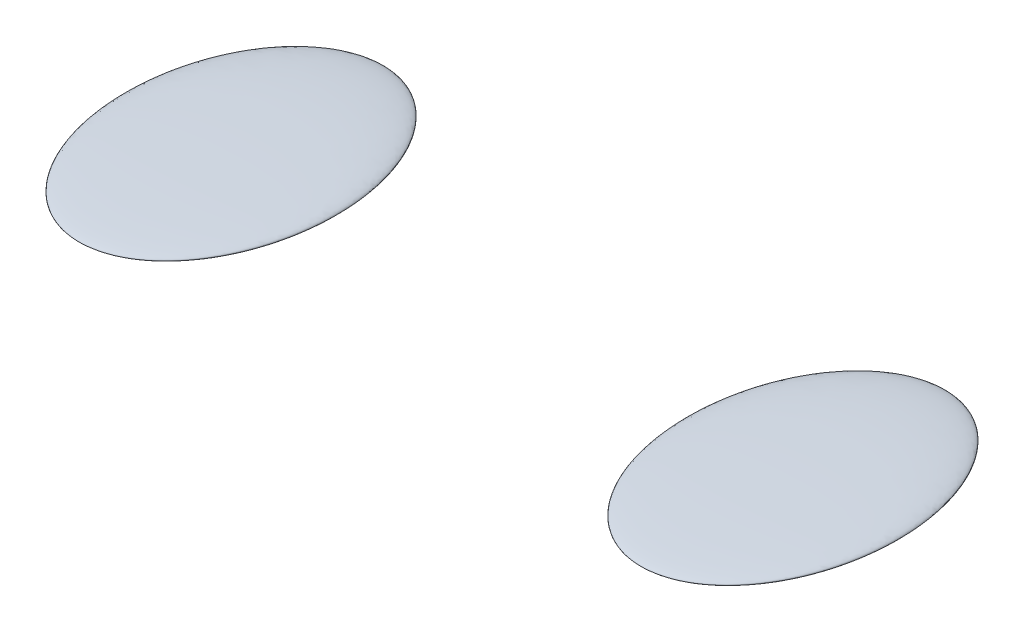
ISO-10303-21;
HEADER;
FILE_DESCRIPTION(('STEP AP214'),'2;1');
FILE_NAME('part.step','',(''),(''),'','','');
FILE_SCHEMA(('AUTOMOTIVE_DESIGN { 1 0 10303 214 1 1 1 1 }'));
ENDSEC;
DATA;
#1=APPLICATION_CONTEXT('core data for automotive mechanical design processes');
#2=APPLICATION_PROTOCOL_DEFINITION('international standard','automotive_design',2000,#1);
#3=PRODUCT_CONTEXT('',#1,'mechanical');
#4=PRODUCT('Part','Part','',(#3));
#5=PRODUCT_RELATED_PRODUCT_CATEGORY('part','',(#4));
#6=PRODUCT_DEFINITION_FORMATION('','',#4);
#7=PRODUCT_DEFINITION_CONTEXT('part definition',#1,'design');
#8=PRODUCT_DEFINITION('design','',#6,#7);
#9=PRODUCT_DEFINITION_SHAPE('','',#8);
#10=(LENGTH_UNIT() NAMED_UNIT(*) SI_UNIT(.MILLI.,.METRE.));
#11=(NAMED_UNIT(*) PLANE_ANGLE_UNIT() SI_UNIT($,.RADIAN.));
#12=(NAMED_UNIT(*) SI_UNIT($,.STERADIAN.) SOLID_ANGLE_UNIT());
#13=UNCERTAINTY_MEASURE_WITH_UNIT(LENGTH_MEASURE(1.E-05),#10,'distance_accuracy_value','');
#14=(GEOMETRIC_REPRESENTATION_CONTEXT(3) GLOBAL_UNCERTAINTY_ASSIGNED_CONTEXT((#13)) GLOBAL_UNIT_ASSIGNED_CONTEXT((#10,
#11,#12)) REPRESENTATION_CONTEXT('',''));
#15=CARTESIAN_POINT('',(0.,0.,0.));
#16=DIRECTION('',(0.,0.,1.));
#17=DIRECTION('',(1.,0.,0.));
#18=AXIS2_PLACEMENT_3D('',#15,#16,#17);
#19=CARTESIAN_POINT('',(-24.,-55.,57.));
#20=CARTESIAN_POINT('',(-15.,-55.,57.));
#21=CARTESIAN_POINT('',(-15.,-55.,70.));
#22=CARTESIAN_POINT('',(-15.,-55.,83.));
#23=CARTESIAN_POINT('',(-24.,-55.,83.));
#24=CARTESIAN_POINT('',(-24.,-55.,57.));
#25=CARTESIAN_POINT('',(-15.,-53.614359353945,57.));
#26=CARTESIAN_POINT('',(-15.,-53.614359353945,70.));
#27=CARTESIAN_POINT('',(-15.,-53.614359353945,83.));
#28=CARTESIAN_POINT('',(-24.,-55.,83.));
#29=CARTESIAN_POINT('',(-24.,-55.,57.));
#30=CARTESIAN_POINT('',(-28.5,-54.307179676972,57.));
#31=CARTESIAN_POINT('',(-28.5,-54.307179676972,70.));
#32=CARTESIAN_POINT('',(-28.5,-54.307179676972,83.));
#33=CARTESIAN_POINT('',(-24.,-55.,83.));
#34=CARTESIAN_POINT('',(-24.,-55.,57.));
#35=CARTESIAN_POINT('',(-42.,-55.,57.));
#36=CARTESIAN_POINT('',(-42.,-55.,70.));
#37=CARTESIAN_POINT('',(-42.,-55.,83.));
#38=CARTESIAN_POINT('',(-24.,-55.,83.));
#39=CARTESIAN_POINT('',(-24.,-55.,57.));
#40=CARTESIAN_POINT('',(-28.5,-55.692820323028,57.));
#41=CARTESIAN_POINT('',(-28.5,-55.692820323028,70.));
#42=CARTESIAN_POINT('',(-28.5,-55.692820323028,83.));
#43=CARTESIAN_POINT('',(-24.,-55.,83.));
#44=CARTESIAN_POINT('',(-24.,-55.,57.));
#45=CARTESIAN_POINT('',(-15.,-56.385640646055,57.));
#46=CARTESIAN_POINT('',(-15.,-56.385640646055,70.));
#47=CARTESIAN_POINT('',(-15.,-56.385640646055,83.));
#48=CARTESIAN_POINT('',(-24.,-55.,83.));
#49=CARTESIAN_POINT('',(-24.,-55.,57.));
#50=CARTESIAN_POINT('',(-15.,-55.,57.));
#51=CARTESIAN_POINT('',(-15.,-55.,70.));
#52=CARTESIAN_POINT('',(-15.,-55.,83.));
#53=CARTESIAN_POINT('',(-24.,-55.,83.));
#54=(BOUNDED_SURFACE() B_SPLINE_SURFACE(2,2,((#19,#20,#21,#22,#23),(#24,#25,#26,#27,#28),(#29,
#30,#31,#32,#33),(#34,#35,#36,#37,#38),(#39,#40,#41,#42,#43),(#44,#45,#46,#47,#48),(#49,#50,#51,
#52,#53)),.UNSPECIFIED.,.T.,.F.,.F.) B_SPLINE_SURFACE_WITH_KNOTS((3,2,2,3),(3,2,3),(0.,
2.094395102393,4.188790204786,6.28318530718),(-1.570796326795,0.,1.570796326795),
.UNSPECIFIED.) GEOMETRIC_REPRESENTATION_ITEM() RATIONAL_B_SPLINE_SURFACE(((1.,0.707106781187,1.,
0.707106781187,1.),(0.5,0.353553390593,0.5,0.353553390593,0.5),(1.,0.707106781187,1.,
0.707106781187,1.),(0.5,0.353553390593,0.5,0.353553390593,0.5),(1.,0.707106781187,1.,
0.707106781187,1.),(0.5,0.353553390593,0.5,0.353553390593,0.5),(1.,0.707106781187,1.,
0.707106781187,1.))) REPRESENTATION_ITEM('') SURFACE());
#55=CARTESIAN_POINT('',(-24.,-55.,83.));
#56=VERTEX_POINT('',#55);
#57=VERTEX_LOOP('',#56);
#58=FACE_BOUND('',#57,.T.);
#59=CARTESIAN_POINT('',(-24.,-55.,57.));
#60=VERTEX_POINT('',#59);
#61=VERTEX_LOOP('',#60);
#62=FACE_BOUND('',#61,.T.);
#63=ADVANCED_FACE('P0_F15',(#58,#62),#54,.T.);
#64=CLOSED_SHELL('',(#63));
#65=MANIFOLD_SOLID_BREP('P0_B1',#64);
#66=CARTESIAN_POINT('',(24.,-55.,57.));
#67=CARTESIAN_POINT('',(33.,-55.,57.));
#68=CARTESIAN_POINT('',(33.,-55.,70.));
#69=CARTESIAN_POINT('',(33.,-55.,83.));
#70=CARTESIAN_POINT('',(24.,-55.,83.));
#71=CARTESIAN_POINT('',(24.,-55.,57.));
#72=CARTESIAN_POINT('',(33.,-53.614359353945,57.));
#73=CARTESIAN_POINT('',(33.,-53.614359353945,70.));
#74=CARTESIAN_POINT('',(33.,-53.614359353945,83.));
#75=CARTESIAN_POINT('',(24.,-55.,83.));
#76=CARTESIAN_POINT('',(24.,-55.,57.));
#77=CARTESIAN_POINT('',(19.5,-54.307179676972,57.));
#78=CARTESIAN_POINT('',(19.5,-54.307179676972,70.));
#79=CARTESIAN_POINT('',(19.5,-54.307179676972,83.));
#80=CARTESIAN_POINT('',(24.,-55.,83.));
#81=CARTESIAN_POINT('',(24.,-55.,57.));
#82=CARTESIAN_POINT('',(6.,-55.,57.));
#83=CARTESIAN_POINT('',(6.,-55.,70.));
#84=CARTESIAN_POINT('',(6.,-55.,83.));
#85=CARTESIAN_POINT('',(24.,-55.,83.));
#86=CARTESIAN_POINT('',(24.,-55.,57.));
#87=CARTESIAN_POINT('',(19.5,-55.692820323028,57.));
#88=CARTESIAN_POINT('',(19.5,-55.692820323028,70.));
#89=CARTESIAN_POINT('',(19.5,-55.692820323028,83.));
#90=CARTESIAN_POINT('',(24.,-55.,83.));
#91=CARTESIAN_POINT('',(24.,-55.,57.));
#92=CARTESIAN_POINT('',(33.,-56.385640646055,57.));
#93=CARTESIAN_POINT('',(33.,-56.385640646055,70.));
#94=CARTESIAN_POINT('',(33.,-56.385640646055,83.));
#95=CARTESIAN_POINT('',(24.,-55.,83.));
#96=CARTESIAN_POINT('',(24.,-55.,57.));
#97=CARTESIAN_POINT('',(33.,-55.,57.));
#98=CARTESIAN_POINT('',(33.,-55.,70.));
#99=CARTESIAN_POINT('',(33.,-55.,83.));
#100=CARTESIAN_POINT('',(24.,-55.,83.));
#101=(BOUNDED_SURFACE() B_SPLINE_SURFACE(2,2,((#66,#67,#68,#69,#70),(#71,#72,#73,#74,#75),(#76,
#77,#78,#79,#80),(#81,#82,#83,#84,#85),(#86,#87,#88,#89,#90),(#91,#92,#93,#94,#95),(#96,#97,#98,
#99,#100)),.UNSPECIFIED.,.T.,.F.,.F.) B_SPLINE_SURFACE_WITH_KNOTS((3,2,2,3),(3,2,3),(0.,
2.094395102393,4.188790204786,6.28318530718),(-1.570796326795,0.,1.570796326795),
.UNSPECIFIED.) GEOMETRIC_REPRESENTATION_ITEM() RATIONAL_B_SPLINE_SURFACE(((1.,0.707106781187,1.,
0.707106781187,1.),(0.5,0.353553390593,0.5,0.353553390593,0.5),(1.,0.707106781187,1.,
0.707106781187,1.),(0.5,0.353553390593,0.5,0.353553390593,0.5),(1.,0.707106781187,1.,
0.707106781187,1.),(0.5,0.353553390593,0.5,0.353553390593,0.5),(1.,0.707106781187,1.,
0.707106781187,1.))) REPRESENTATION_ITEM('') SURFACE());
#102=CARTESIAN_POINT('',(24.,-55.,83.));
#103=VERTEX_POINT('',#102);
#104=VERTEX_LOOP('',#103);
#105=FACE_BOUND('',#104,.T.);
#106=CARTESIAN_POINT('',(24.,-55.,57.));
#107=VERTEX_POINT('',#106);
#108=VERTEX_LOOP('',#107);
#109=FACE_BOUND('',#108,.T.);
#110=ADVANCED_FACE('P1_F15',(#105,#109),#101,.T.);
#111=CLOSED_SHELL('',(#110));
#112=MANIFOLD_SOLID_BREP('P1_B1',#111);
#113=ADVANCED_BREP_SHAPE_REPRESENTATION('',(#18,#65,#112),#14);
#114=SHAPE_DEFINITION_REPRESENTATION(#9,#113);
ENDSEC;
END-ISO-10303-21;
